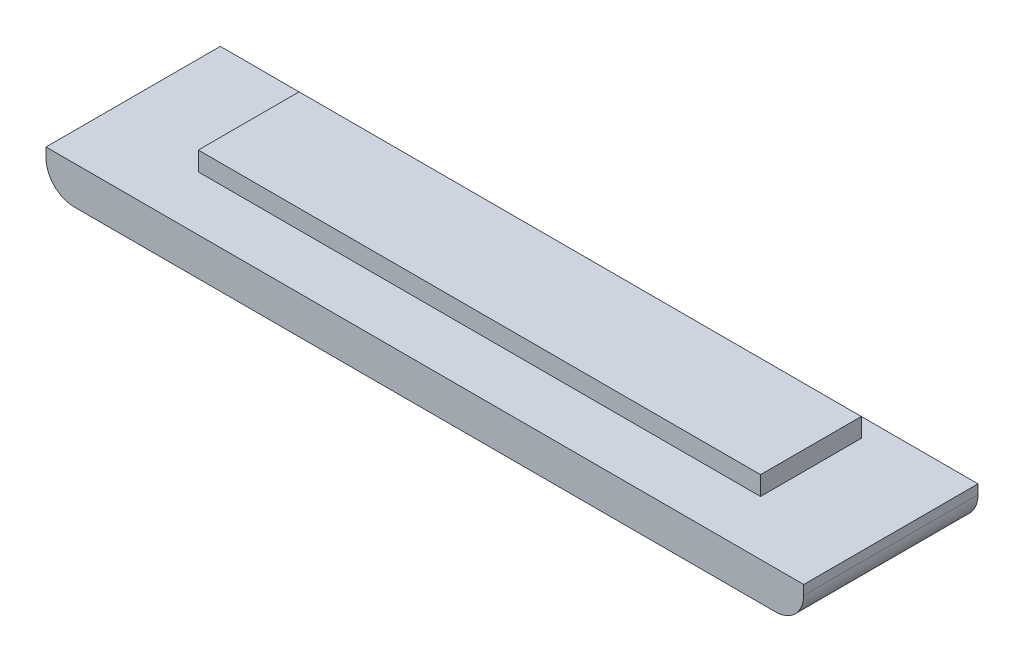
ISO-10303-21;
HEADER;
FILE_DESCRIPTION(('STEP AP214'),'2;1');
FILE_NAME('part.step','',(''),(''),'','','');
FILE_SCHEMA(('AUTOMOTIVE_DESIGN { 1 0 10303 214 1 1 1 1 }'));
ENDSEC;
DATA;
#1=APPLICATION_CONTEXT('core data for automotive mechanical design processes');
#2=APPLICATION_PROTOCOL_DEFINITION('international standard','automotive_design',2000,#1);
#3=PRODUCT_CONTEXT('',#1,'mechanical');
#4=PRODUCT('Part','Part','',(#3));
#5=PRODUCT_RELATED_PRODUCT_CATEGORY('part','',(#4));
#6=PRODUCT_DEFINITION_FORMATION('','',#4);
#7=PRODUCT_DEFINITION_CONTEXT('part definition',#1,'design');
#8=PRODUCT_DEFINITION('design','',#6,#7);
#9=PRODUCT_DEFINITION_SHAPE('','',#8);
#10=(LENGTH_UNIT() NAMED_UNIT(*) SI_UNIT(.MILLI.,.METRE.));
#11=(NAMED_UNIT(*) PLANE_ANGLE_UNIT() SI_UNIT($,.RADIAN.));
#12=(NAMED_UNIT(*) SI_UNIT($,.STERADIAN.) SOLID_ANGLE_UNIT());
#13=UNCERTAINTY_MEASURE_WITH_UNIT(LENGTH_MEASURE(1.E-05),#10,'distance_accuracy_value','');
#14=(GEOMETRIC_REPRESENTATION_CONTEXT(3) GLOBAL_UNCERTAINTY_ASSIGNED_CONTEXT((#13)) GLOBAL_UNIT_ASSIGNED_CONTEXT((#10,
#11,#12)) REPRESENTATION_CONTEXT('',''));
#15=CARTESIAN_POINT('',(0.,0.,0.));
#16=DIRECTION('',(0.,0.,1.));
#17=DIRECTION('',(1.,0.,0.));
#18=AXIS2_PLACEMENT_3D('',#15,#16,#17);
#19=CARTESIAN_POINT('',(0.,19.05,0.));
#20=DIRECTION('',(1.,0.,0.));
#21=DIRECTION('',(0.,0.,-1.));
#22=AXIS2_PLACEMENT_3D('',#19,#20,#21);
#23=PLANE('',#22);
#24=DIRECTION('',(0.,-1.,0.));
#25=VECTOR('',#24,1.);
#26=CARTESIAN_POINT('',(0.,19.05,-58.42));
#27=LINE('',#26,#25);
#28=CARTESIAN_POINT('',(0.,12.7,-58.42));
#29=VERTEX_POINT('',#28);
#30=CARTESIAN_POINT('',(0.,9.525,-58.42));
#31=VERTEX_POINT('',#30);
#32=EDGE_CURVE('E194',#29,#31,#27,.T.);
#33=ORIENTED_EDGE('',*,*,#32,.T.);
#34=DIRECTION('',(0.,0.,1.));
#35=VECTOR('',#34,1.);
#36=CARTESIAN_POINT('',(0.,9.525,0.));
#37=LINE('',#36,#35);
#38=CARTESIAN_POINT('',(0.,9.525,0.));
#39=VERTEX_POINT('',#38);
#40=EDGE_CURVE('E11',#31,#39,#37,.T.);
#41=ORIENTED_EDGE('',*,*,#40,.T.);
#42=DIRECTION('',(0.,-1.,0.));
#43=VECTOR('',#42,1.);
#44=CARTESIAN_POINT('',(0.,19.05,0.));
#45=LINE('',#44,#43);
#46=CARTESIAN_POINT('',(0.,12.7,0.));
#47=VERTEX_POINT('',#46);
#48=EDGE_CURVE('E206',#47,#39,#45,.T.);
#49=ORIENTED_EDGE('',*,*,#48,.F.);
#50=DIRECTION('',(0.,0.,1.));
#51=VECTOR('',#50,1.);
#52=CARTESIAN_POINT('',(0.,12.7,0.));
#53=LINE('',#52,#51);
#54=EDGE_CURVE('E160',#29,#47,#53,.T.);
#55=ORIENTED_EDGE('',*,*,#54,.F.);
#56=EDGE_LOOP('',(#33,#41,#49,#55));
#57=FACE_BOUND('',#56,.T.);
#58=ADVANCED_FACE('F41',(#57),#23,.F.);
#59=CARTESIAN_POINT('',(0.,19.05,0.));
#60=DIRECTION('',(0.,0.,-1.));
#61=DIRECTION('',(-1.,0.,0.));
#62=AXIS2_PLACEMENT_3D('',#59,#60,#61);
#63=PLANE('',#62);
#64=DIRECTION('',(1.,0.,0.));
#65=VECTOR('',#64,1.);
#66=CARTESIAN_POINT('',(0.,0.,0.));
#67=LINE('',#66,#65);
#68=CARTESIAN_POINT('',(9.525,0.,0.));
#69=VERTEX_POINT('',#68);
#70=CARTESIAN_POINT('',(244.475,0.,0.));
#71=VERTEX_POINT('',#70);
#72=EDGE_CURVE('E182',#69,#71,#67,.T.);
#73=ORIENTED_EDGE('',*,*,#72,.T.);
#74=CARTESIAN_POINT('',(244.475,9.525,0.));
#75=DIRECTION('',(0.,0.,-1.));
#76=DIRECTION('',(-1.,0.,0.));
#77=AXIS2_PLACEMENT_3D('',#74,#75,#76);
#78=CIRCLE('',#77,9.525);
#79=CARTESIAN_POINT('',(254.,9.525,0.));
#80=VERTEX_POINT('',#79);
#81=EDGE_CURVE('E50',#71,#80,#78,.F.);
#82=ORIENTED_EDGE('',*,*,#81,.T.);
#83=DIRECTION('',(0.,-1.,0.));
#84=VECTOR('',#83,1.);
#85=CARTESIAN_POINT('',(254.,19.05,0.));
#86=LINE('',#85,#84);
#87=CARTESIAN_POINT('',(254.,12.7,0.));
#88=VERTEX_POINT('',#87);
#89=EDGE_CURVE('E202',#88,#80,#86,.T.);
#90=ORIENTED_EDGE('',*,*,#89,.F.);
#91=DIRECTION('',(1.,0.,0.));
#92=VECTOR('',#91,1.);
#93=CARTESIAN_POINT('',(0.,12.7,0.));
#94=LINE('',#93,#92);
#95=EDGE_CURVE('E163',#47,#88,#94,.T.);
#96=ORIENTED_EDGE('',*,*,#95,.F.);
#97=ORIENTED_EDGE('',*,*,#48,.T.);
#98=CARTESIAN_POINT('',(9.525,9.525,0.));
#99=DIRECTION('',(0.,0.,-1.));
#100=DIRECTION('',(-1.,0.,0.));
#101=AXIS2_PLACEMENT_3D('',#98,#99,#100);
#102=CIRCLE('',#101,9.525);
#103=EDGE_CURVE('E57',#39,#69,#102,.F.);
#104=ORIENTED_EDGE('',*,*,#103,.T.);
#105=EDGE_LOOP('',(#73,#82,#90,#96,#97,#104));
#106=FACE_BOUND('',#105,.T.);
#107=ADVANCED_FACE('F230',(#106),#63,.F.);
#108=CARTESIAN_POINT('',(254.,19.05,0.));
#109=DIRECTION('',(-1.,0.,0.));
#110=DIRECTION('',(0.,0.,1.));
#111=AXIS2_PLACEMENT_3D('',#108,#109,#110);
#112=PLANE('',#111);
#113=ORIENTED_EDGE('',*,*,#89,.T.);
#114=DIRECTION('',(0.,0.,-1.));
#115=VECTOR('',#114,1.);
#116=CARTESIAN_POINT('',(254.,9.525,-58.42));
#117=LINE('',#116,#115);
#118=CARTESIAN_POINT('',(254.,9.525,-58.42));
#119=VERTEX_POINT('',#118);
#120=EDGE_CURVE('E210',#80,#119,#117,.T.);
#121=ORIENTED_EDGE('',*,*,#120,.T.);
#122=DIRECTION('',(0.,-1.,0.));
#123=VECTOR('',#122,1.);
#124=CARTESIAN_POINT('',(254.,19.05,-58.42));
#125=LINE('',#124,#123);
#126=CARTESIAN_POINT('',(254.,12.7,-58.42));
#127=VERTEX_POINT('',#126);
#128=EDGE_CURVE('E198',#127,#119,#125,.T.);
#129=ORIENTED_EDGE('',*,*,#128,.F.);
#130=DIRECTION('',(0.,0.,-1.));
#131=VECTOR('',#130,1.);
#132=CARTESIAN_POINT('',(254.,12.7,0.));
#133=LINE('',#132,#131);
#134=EDGE_CURVE('E166',#88,#127,#133,.T.);
#135=ORIENTED_EDGE('',*,*,#134,.F.);
#136=EDGE_LOOP('',(#113,#121,#129,#135));
#137=FACE_BOUND('',#136,.T.);
#138=ADVANCED_FACE('F236',(#137),#112,.F.);
#139=CARTESIAN_POINT('',(0.,19.05,-58.42));
#140=DIRECTION('',(0.,0.,1.));
#141=DIRECTION('',(1.,0.,0.));
#142=AXIS2_PLACEMENT_3D('',#139,#140,#141);
#143=PLANE('',#142);
#144=ORIENTED_EDGE('',*,*,#128,.T.);
#145=CARTESIAN_POINT('',(244.475,9.525,-58.42));
#146=DIRECTION('',(0.,0.,1.));
#147=DIRECTION('',(1.,0.,0.));
#148=AXIS2_PLACEMENT_3D('',#145,#146,#147);
#149=CIRCLE('',#148,9.525);
#150=CARTESIAN_POINT('',(244.475,0.,-58.42));
#151=VERTEX_POINT('',#150);
#152=EDGE_CURVE('E217',#119,#151,#149,.F.);
#153=ORIENTED_EDGE('',*,*,#152,.T.);
#154=DIRECTION('',(-1.,0.,0.));
#155=VECTOR('',#154,1.);
#156=CARTESIAN_POINT('',(0.,0.,-58.42));
#157=LINE('',#156,#155);
#158=CARTESIAN_POINT('',(9.525,0.,-58.42));
#159=VERTEX_POINT('',#158);
#160=EDGE_CURVE('E190',#151,#159,#157,.T.);
#161=ORIENTED_EDGE('',*,*,#160,.T.);
#162=CARTESIAN_POINT('',(9.525,9.525,-58.42));
#163=DIRECTION('',(0.,0.,1.));
#164=DIRECTION('',(1.,0.,0.));
#165=AXIS2_PLACEMENT_3D('',#162,#163,#164);
#166=CIRCLE('',#165,9.525);
#167=EDGE_CURVE('E214',#159,#31,#166,.F.);
#168=ORIENTED_EDGE('',*,*,#167,.T.);
#169=ORIENTED_EDGE('',*,*,#32,.F.);
#170=DIRECTION('',(-1.,0.,0.));
#171=VECTOR('',#170,1.);
#172=CARTESIAN_POINT('',(0.,12.7,-58.42));
#173=LINE('',#172,#171);
#174=EDGE_CURVE('E133',#127,#29,#173,.T.);
#175=ORIENTED_EDGE('',*,*,#174,.F.);
#176=EDGE_LOOP('',(#144,#153,#161,#168,#169,#175));
#177=FACE_BOUND('',#176,.T.);
#178=ADVANCED_FACE('F240',(#177),#143,.F.);
#179=CARTESIAN_POINT('',(0.,0.,0.));
#180=DIRECTION('',(0.,-1.,0.));
#181=DIRECTION('',(0.,0.,-1.));
#182=AXIS2_PLACEMENT_3D('',#179,#180,#181);
#183=PLANE('',#182);
#184=ORIENTED_EDGE('',*,*,#160,.F.);
#185=DIRECTION('',(0.,0.,-1.));
#186=VECTOR('',#185,1.);
#187=CARTESIAN_POINT('',(244.475,0.,0.));
#188=LINE('',#187,#186);
#189=EDGE_CURVE('E64',#151,#71,#188,.F.);
#190=ORIENTED_EDGE('',*,*,#189,.T.);
#191=ORIENTED_EDGE('',*,*,#72,.F.);
#192=DIRECTION('',(0.,0.,1.));
#193=VECTOR('',#192,1.);
#194=CARTESIAN_POINT('',(9.525,0.,-58.42));
#195=LINE('',#194,#193);
#196=EDGE_CURVE('E220',#69,#159,#195,.F.);
#197=ORIENTED_EDGE('',*,*,#196,.T.);
#198=EDGE_LOOP('',(#184,#190,#191,#197));
#199=FACE_BOUND('',#198,.T.);
#200=ADVANCED_FACE('F243',(#199),#183,.T.);
#201=CARTESIAN_POINT('',(0.,12.7,-18.288));
#202=DIRECTION('',(0.,0.,-1.));
#203=DIRECTION('',(-1.,0.,0.));
#204=AXIS2_PLACEMENT_3D('',#201,#202,#203);
#205=PLANE('',#204);
#206=DIRECTION('',(-1.,0.,0.));
#207=VECTOR('',#206,1.);
#208=CARTESIAN_POINT('',(0.,19.05,-18.288));
#209=LINE('',#208,#207);
#210=CARTESIAN_POINT('',(221.234,19.05,-18.288));
#211=VERTEX_POINT('',#210);
#212=CARTESIAN_POINT('',(32.766,19.05,-18.288));
#213=VERTEX_POINT('',#212);
#214=EDGE_CURVE('E127',#211,#213,#209,.T.);
#215=ORIENTED_EDGE('',*,*,#214,.T.);
#216=DIRECTION('',(0.,1.,0.));
#217=VECTOR('',#216,1.);
#218=CARTESIAN_POINT('',(32.766,12.7,-18.288));
#219=LINE('',#218,#217);
#220=CARTESIAN_POINT('',(32.766,12.7,-18.288));
#221=VERTEX_POINT('',#220);
#222=EDGE_CURVE('E121',#221,#213,#219,.T.);
#223=ORIENTED_EDGE('',*,*,#222,.F.);
#224=DIRECTION('',(-1.,0.,0.));
#225=VECTOR('',#224,1.);
#226=CARTESIAN_POINT('',(0.,12.7,-18.288));
#227=LINE('',#226,#225);
#228=CARTESIAN_POINT('',(221.234,12.7,-18.288));
#229=VERTEX_POINT('',#228);
#230=EDGE_CURVE('E125',#229,#221,#227,.T.);
#231=ORIENTED_EDGE('',*,*,#230,.F.);
#232=DIRECTION('',(0.,1.,0.));
#233=VECTOR('',#232,1.);
#234=CARTESIAN_POINT('',(221.234,12.7,-18.288));
#235=LINE('',#234,#233);
#236=EDGE_CURVE('E179',#229,#211,#235,.T.);
#237=ORIENTED_EDGE('',*,*,#236,.T.);
#238=EDGE_LOOP('',(#215,#223,#231,#237));
#239=FACE_BOUND('',#238,.T.);
#240=ADVANCED_FACE('F123',(#239),#205,.F.);
#241=CARTESIAN_POINT('',(221.234,12.7,0.));
#242=DIRECTION('',(1.,0.,0.));
#243=DIRECTION('',(0.,0.,-1.));
#244=AXIS2_PLACEMENT_3D('',#241,#242,#243);
#245=PLANE('',#244);
#246=DIRECTION('',(0.,0.,-1.));
#247=VECTOR('',#246,1.);
#248=CARTESIAN_POINT('',(221.234,19.05,0.));
#249=LINE('',#248,#247);
#250=CARTESIAN_POINT('',(221.234,19.05,-52.07));
#251=VERTEX_POINT('',#250);
#252=EDGE_CURVE('E149',#211,#251,#249,.T.);
#253=ORIENTED_EDGE('',*,*,#252,.F.);
#254=ORIENTED_EDGE('',*,*,#236,.F.);
#255=DIRECTION('',(0.,0.,-1.));
#256=VECTOR('',#255,1.);
#257=CARTESIAN_POINT('',(221.234,12.7,0.));
#258=LINE('',#257,#256);
#259=CARTESIAN_POINT('',(221.234,12.7,-52.07));
#260=VERTEX_POINT('',#259);
#261=EDGE_CURVE('E147',#229,#260,#258,.T.);
#262=ORIENTED_EDGE('',*,*,#261,.T.);
#263=DIRECTION('',(0.,1.,0.));
#264=VECTOR('',#263,1.);
#265=CARTESIAN_POINT('',(221.234,12.7,-52.07));
#266=LINE('',#265,#264);
#267=EDGE_CURVE('E183',#260,#251,#266,.T.);
#268=ORIENTED_EDGE('',*,*,#267,.T.);
#269=EDGE_LOOP('',(#253,#254,#262,#268));
#270=FACE_BOUND('',#269,.T.);
#271=ADVANCED_FACE('F338',(#270),#245,.T.);
#272=CARTESIAN_POINT('',(0.,12.7,-52.07));
#273=DIRECTION('',(0.,0.,-1.));
#274=DIRECTION('',(-1.,0.,0.));
#275=AXIS2_PLACEMENT_3D('',#272,#273,#274);
#276=PLANE('',#275);
#277=DIRECTION('',(-1.,0.,0.));
#278=VECTOR('',#277,1.);
#279=CARTESIAN_POINT('',(0.,19.05,-52.07));
#280=LINE('',#279,#278);
#281=CARTESIAN_POINT('',(32.766,19.05,-52.07));
#282=VERTEX_POINT('',#281);
#283=EDGE_CURVE('E153',#251,#282,#280,.T.);
#284=ORIENTED_EDGE('',*,*,#283,.F.);
#285=ORIENTED_EDGE('',*,*,#267,.F.);
#286=DIRECTION('',(-1.,0.,0.));
#287=VECTOR('',#286,1.);
#288=CARTESIAN_POINT('',(0.,12.7,-52.07));
#289=LINE('',#288,#287);
#290=CARTESIAN_POINT('',(32.766,12.7,-52.07));
#291=VERTEX_POINT('',#290);
#292=EDGE_CURVE('E142',#260,#291,#289,.T.);
#293=ORIENTED_EDGE('',*,*,#292,.T.);
#294=DIRECTION('',(0.,1.,0.));
#295=VECTOR('',#294,1.);
#296=CARTESIAN_POINT('',(32.766,12.7,-52.07));
#297=LINE('',#296,#295);
#298=EDGE_CURVE('E132',#291,#282,#297,.T.);
#299=ORIENTED_EDGE('',*,*,#298,.T.);
#300=EDGE_LOOP('',(#284,#285,#293,#299));
#301=FACE_BOUND('',#300,.T.);
#302=ADVANCED_FACE('F257',(#301),#276,.T.);
#303=CARTESIAN_POINT('',(32.766,12.7,0.));
#304=DIRECTION('',(1.,0.,0.));
#305=DIRECTION('',(0.,0.,-1.));
#306=AXIS2_PLACEMENT_3D('',#303,#304,#305);
#307=PLANE('',#306);
#308=DIRECTION('',(0.,0.,-1.));
#309=VECTOR('',#308,1.);
#310=CARTESIAN_POINT('',(32.766,19.05,0.));
#311=LINE('',#310,#309);
#312=EDGE_CURVE('E173',#213,#282,#311,.T.);
#313=ORIENTED_EDGE('',*,*,#312,.T.);
#314=ORIENTED_EDGE('',*,*,#298,.F.);
#315=DIRECTION('',(0.,0.,-1.));
#316=VECTOR('',#315,1.);
#317=CARTESIAN_POINT('',(32.766,12.7,0.));
#318=LINE('',#317,#316);
#319=EDGE_CURVE('E137',#221,#291,#318,.T.);
#320=ORIENTED_EDGE('',*,*,#319,.F.);
#321=ORIENTED_EDGE('',*,*,#222,.T.);
#322=EDGE_LOOP('',(#313,#314,#320,#321));
#323=FACE_BOUND('',#322,.T.);
#324=ADVANCED_FACE('F138',(#323),#307,.F.);
#325=CARTESIAN_POINT('',(0.,12.7,0.));
#326=DIRECTION('',(0.,1.,0.));
#327=DIRECTION('',(0.,0.,1.));
#328=AXIS2_PLACEMENT_3D('',#325,#326,#327);
#329=PLANE('',#328);
#330=ORIENTED_EDGE('',*,*,#230,.T.);
#331=ORIENTED_EDGE('',*,*,#319,.T.);
#332=ORIENTED_EDGE('',*,*,#292,.F.);
#333=ORIENTED_EDGE('',*,*,#261,.F.);
#334=EDGE_LOOP('',(#330,#331,#332,#333));
#335=FACE_BOUND('',#334,.T.);
#336=ORIENTED_EDGE('',*,*,#54,.T.);
#337=ORIENTED_EDGE('',*,*,#95,.T.);
#338=ORIENTED_EDGE('',*,*,#134,.T.);
#339=ORIENTED_EDGE('',*,*,#174,.T.);
#340=EDGE_LOOP('',(#336,#337,#338,#339));
#341=FACE_BOUND('',#340,.T.);
#342=ADVANCED_FACE('F145',(#335,#341),#329,.T.);
#343=CARTESIAN_POINT('',(0.,19.05,0.));
#344=DIRECTION('',(0.,-1.,0.));
#345=DIRECTION('',(0.,0.,-1.));
#346=AXIS2_PLACEMENT_3D('',#343,#344,#345);
#347=PLANE('',#346);
#348=ORIENTED_EDGE('',*,*,#312,.F.);
#349=ORIENTED_EDGE('',*,*,#214,.F.);
#350=ORIENTED_EDGE('',*,*,#252,.T.);
#351=ORIENTED_EDGE('',*,*,#283,.T.);
#352=EDGE_LOOP('',(#348,#349,#350,#351));
#353=FACE_BOUND('',#352,.T.);
#354=ADVANCED_FACE('F249',(#353),#347,.F.);
#355=CARTESIAN_POINT('',(244.475,9.525,0.));
#356=DIRECTION('',(0.,0.,1.));
#357=DIRECTION('',(1.,0.,0.));
#358=AXIS2_PLACEMENT_3D('',#355,#356,#357);
#359=CYLINDRICAL_SURFACE('',#358,9.525);
#360=ORIENTED_EDGE('',*,*,#81,.F.);
#361=ORIENTED_EDGE('',*,*,#189,.F.);
#362=ORIENTED_EDGE('',*,*,#152,.F.);
#363=ORIENTED_EDGE('',*,*,#120,.F.);
#364=EDGE_LOOP('',(#360,#361,#362,#363));
#365=FACE_BOUND('',#364,.T.);
#366=ADVANCED_FACE('F238',(#365),#359,.T.);
#367=CARTESIAN_POINT('',(9.525,9.525,0.));
#368=DIRECTION('',(0.,0.,-1.));
#369=DIRECTION('',(-1.,0.,0.));
#370=AXIS2_PLACEMENT_3D('',#367,#368,#369);
#371=CYLINDRICAL_SURFACE('',#370,9.525);
#372=ORIENTED_EDGE('',*,*,#167,.F.);
#373=ORIENTED_EDGE('',*,*,#196,.F.);
#374=ORIENTED_EDGE('',*,*,#103,.F.);
#375=ORIENTED_EDGE('',*,*,#40,.F.);
#376=EDGE_LOOP('',(#372,#373,#374,#375));
#377=FACE_BOUND('',#376,.T.);
#378=ADVANCED_FACE('F43',(#377),#371,.T.);
#379=CLOSED_SHELL('',(#58,#107,#138,#178,#200,#240,#271,#302,#324,#342,#354,#366,#378));
#380=MANIFOLD_SOLID_BREP('B2',#379);
#381=ADVANCED_BREP_SHAPE_REPRESENTATION('',(#18,#380),#14);
#382=SHAPE_DEFINITION_REPRESENTATION(#9,#381);
ENDSEC;
END-ISO-10303-21;
